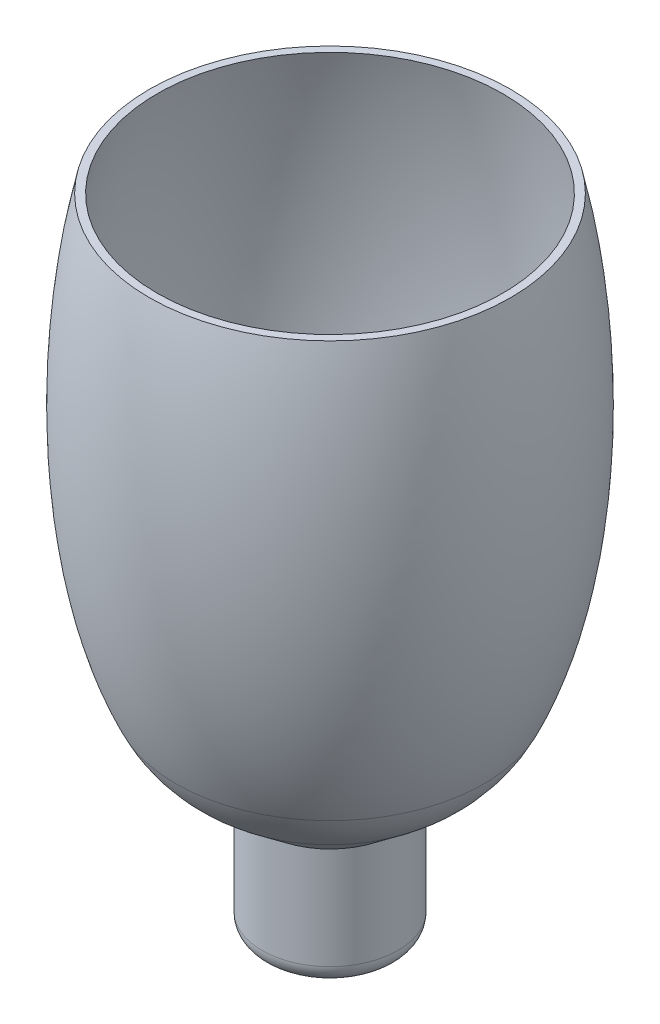
ISO-10303-21;
HEADER;
FILE_DESCRIPTION(('STEP AP214'),'2;1');
FILE_NAME('part.step','',(''),(''),'','','');
FILE_SCHEMA(('AUTOMOTIVE_DESIGN { 1 0 10303 214 1 1 1 1 }'));
ENDSEC;
DATA;
#1=APPLICATION_CONTEXT('core data for automotive mechanical design processes');
#2=APPLICATION_PROTOCOL_DEFINITION('international standard','automotive_design',2000,#1);
#3=PRODUCT_CONTEXT('',#1,'mechanical');
#4=PRODUCT('Part','Part','',(#3));
#5=PRODUCT_RELATED_PRODUCT_CATEGORY('part','',(#4));
#6=PRODUCT_DEFINITION_FORMATION('','',#4);
#7=PRODUCT_DEFINITION_CONTEXT('part definition',#1,'design');
#8=PRODUCT_DEFINITION('design','',#6,#7);
#9=PRODUCT_DEFINITION_SHAPE('','',#8);
#10=(LENGTH_UNIT() NAMED_UNIT(*) SI_UNIT(.MILLI.,.METRE.));
#11=(NAMED_UNIT(*) PLANE_ANGLE_UNIT() SI_UNIT($,.RADIAN.));
#12=(NAMED_UNIT(*) SI_UNIT($,.STERADIAN.) SOLID_ANGLE_UNIT());
#13=UNCERTAINTY_MEASURE_WITH_UNIT(LENGTH_MEASURE(1.E-05),#10,'distance_accuracy_value','');
#14=(GEOMETRIC_REPRESENTATION_CONTEXT(3) GLOBAL_UNCERTAINTY_ASSIGNED_CONTEXT((#13)) GLOBAL_UNIT_ASSIGNED_CONTEXT((#10,
#11,#12)) REPRESENTATION_CONTEXT('',''));
#15=CARTESIAN_POINT('',(0.,0.,0.));
#16=DIRECTION('',(0.,0.,1.));
#17=DIRECTION('',(1.,0.,0.));
#18=AXIS2_PLACEMENT_3D('',#15,#16,#17);
#19=CARTESIAN_POINT('',(-13.,0.,0.));
#20=DIRECTION('',(0.,1.,0.));
#21=DIRECTION('',(0.,0.,1.));
#22=AXIS2_PLACEMENT_3D('',#19,#20,#21);
#23=PLANE('',#22);
#24=CARTESIAN_POINT('',(0.,0.,0.));
#25=DIRECTION('',(0.,-1.,0.));
#26=DIRECTION('',(0.,0.,-1.));
#27=AXIS2_PLACEMENT_3D('',#24,#25,#26);
#28=CIRCLE('',#27,13.);
#29=CARTESIAN_POINT('',(0.,0.,-13.));
#30=VERTEX_POINT('',#29);
#31=EDGE_CURVE('E10',#30,#30,#28,.T.);
#32=ORIENTED_EDGE('',*,*,#31,.T.);
#33=EDGE_LOOP('',(#32));
#34=FACE_BOUND('',#33,.T.);
#35=ADVANCED_FACE('F31',(#34),#23,.F.);
#36=CARTESIAN_POINT('',(0.,5.,0.));
#37=DIRECTION('',(0.,-1.,0.));
#38=DIRECTION('',(0.,0.,-1.));
#39=AXIS2_PLACEMENT_3D('',#36,#37,#38);
#40=TOROIDAL_SURFACE('',#39,13.,5.);
#41=ORIENTED_EDGE('',*,*,#31,.F.);
#42=EDGE_LOOP('',(#41));
#43=FACE_BOUND('',#42,.T.);
#44=CARTESIAN_POINT('',(0.,5.00000000000003,0.));
#45=DIRECTION('',(0.,-1.,0.));
#46=DIRECTION('',(0.,0.,-1.));
#47=AXIS2_PLACEMENT_3D('',#44,#45,#46);
#48=CIRCLE('',#47,18.);
#49=CARTESIAN_POINT('',(0.,5.00000000000003,-18.));
#50=VERTEX_POINT('',#49);
#51=EDGE_CURVE('E37',#50,#50,#48,.T.);
#52=ORIENTED_EDGE('',*,*,#51,.T.);
#53=EDGE_LOOP('',(#52));
#54=FACE_BOUND('',#53,.T.);
#55=ADVANCED_FACE('F90',(#43,#54),#40,.T.);
#56=CARTESIAN_POINT('',(0.,0.,0.));
#57=DIRECTION('',(0.,-1.,0.));
#58=DIRECTION('',(0.,0.,-1.));
#59=AXIS2_PLACEMENT_3D('',#56,#57,#58);
#60=CYLINDRICAL_SURFACE('',#59,18.);
#61=ORIENTED_EDGE('',*,*,#51,.F.);
#62=EDGE_LOOP('',(#61));
#63=FACE_BOUND('',#62,.T.);
#64=CARTESIAN_POINT('',(0.,32.,0.));
#65=DIRECTION('',(0.,-1.,0.));
#66=DIRECTION('',(0.,0.,-1.));
#67=AXIS2_PLACEMENT_3D('',#64,#65,#66);
#68=CIRCLE('',#67,18.);
#69=CARTESIAN_POINT('',(0.,32.,-18.));
#70=VERTEX_POINT('',#69);
#71=EDGE_CURVE('E41',#70,#70,#68,.T.);
#72=ORIENTED_EDGE('',*,*,#71,.T.);
#73=EDGE_LOOP('',(#72));
#74=FACE_BOUND('',#73,.T.);
#75=ADVANCED_FACE('F87',(#63,#74),#60,.T.);
#76=CARTESIAN_POINT('',(0.,41.9691724404206,0.));
#77=DIRECTION('',(0.,1.,0.));
#78=DIRECTION('',(0.,0.,1.));
#79=AXIS2_PLACEMENT_3D('',#76,#77,#78);
#80=CONICAL_SURFACE('',#79,30.7203979744217,0.906064162360728);
#81=ORIENTED_EDGE('',*,*,#71,.F.);
#82=EDGE_LOOP('',(#81));
#83=FACE_BOUND('',#82,.T.);
#84=CARTESIAN_POINT('',(0.,41.9691724404206,0.));
#85=DIRECTION('',(0.,-1.,0.));
#86=DIRECTION('',(0.,0.,-1.));
#87=AXIS2_PLACEMENT_3D('',#84,#85,#86);
#88=CIRCLE('',#87,30.7203979744217);
#89=CARTESIAN_POINT('',(0.,41.9691724404206,-30.7203979744217));
#90=VERTEX_POINT('',#89);
#91=EDGE_CURVE('E45',#90,#90,#88,.T.);
#92=ORIENTED_EDGE('',*,*,#91,.T.);
#93=EDGE_LOOP('',(#92));
#94=FACE_BOUND('',#93,.T.);
#95=ADVANCED_FACE('F83',(#83,#94),#80,.T.);
#96=CARTESIAN_POINT('',(0.,69.5170433953372,0.));
#97=DIRECTION('',(0.,-1.,0.));
#98=DIRECTION('',(0.,0.,-1.));
#99=AXIS2_PLACEMENT_3D('',#96,#97,#98);
#100=DEGENERATE_TOROIDAL_SURFACE('',#99,9.1307058540772,35.,.T.);
#101=ORIENTED_EDGE('',*,*,#91,.F.);
#102=EDGE_LOOP('',(#101));
#103=FACE_BOUND('',#102,.T.);
#104=CARTESIAN_POINT('',(0.,54.635914820331,0.));
#105=DIRECTION('',(0.,-1.,0.));
#106=DIRECTION('',(0.,0.,-1.));
#107=AXIS2_PLACEMENT_3D('',#104,#105,#106);
#108=CIRCLE('',#107,40.8095949181548);
#109=CARTESIAN_POINT('',(0.,54.635914820331,-40.8095949181548));
#110=VERTEX_POINT('',#109);
#111=EDGE_CURVE('E50',#110,#110,#108,.T.);
#112=ORIENTED_EDGE('',*,*,#111,.T.);
#113=EDGE_LOOP('',(#112));
#114=FACE_BOUND('',#113,.T.);
#115=ADVANCED_FACE('F73',(#103,#114),#100,.T.);
#116=CARTESIAN_POINT('',(-47.6005029280847,170.765551901472,0.));
#117=CARTESIAN_POINT('',(-47.6823154498915,170.41097944529,0.));
#118=CARTESIAN_POINT('',(-47.7641279716982,170.056406989108,0.));
#119=CARTESIAN_POINT('',(-47.8459404935049,169.701834532926,0.));
#120=CARTESIAN_POINT('',(-56.0271926741776,134.244588914736,0.));
#121=CARTESIAN_POINT('',(-55.3369313036721,85.5616524371871,0.));
#122=CARTESIAN_POINT('',(-40.8095949181548,54.635914820331,0.));
#123=B_SPLINE_CURVE_WITH_KNOTS('',3,(#116,#117,#118,#119,#120,#121,#122),.UNSPECIFIED.,.F.,.F.,
(4,3,4),(-0.00888014655076905,0.,0.888014655076905),.UNSPECIFIED.);
#124=CARTESIAN_POINT('',(0.,32.,0.));
#125=DIRECTION('',(0.,-1.,0.));
#126=AXIS1_PLACEMENT('',#124,#125);
#127=SURFACE_OF_REVOLUTION('',#123,#126);
#128=ORIENTED_EDGE('',*,*,#111,.F.);
#129=EDGE_LOOP('',(#128));
#130=FACE_BOUND('',#129,.T.);
#131=CARTESIAN_POINT('',(0.,169.701834532926,0.));
#132=DIRECTION('',(0.,-1.,0.));
#133=DIRECTION('',(0.,0.,-1.));
#134=AXIS2_PLACEMENT_3D('',#131,#132,#133);
#135=CIRCLE('',#134,47.8459404935049);
#136=CARTESIAN_POINT('',(0.,169.701834532926,-47.8459404935049));
#137=VERTEX_POINT('',#136);
#138=EDGE_CURVE('E53',#137,#137,#135,.T.);
#139=ORIENTED_EDGE('',*,*,#138,.T.);
#140=EDGE_LOOP('',(#139));
#141=FACE_BOUND('',#140,.T.);
#142=ADVANCED_FACE('F67',(#130,#141),#127,.T.);
#143=CARTESIAN_POINT('',(0.,169.701834532926,0.));
#144=DIRECTION('',(0.,-1.,0.));
#145=DIRECTION('',(0.,0.,-1.));
#146=AXIS2_PLACEMENT_3D('',#143,#144,#145);
#147=PLANE('',#146);
#148=CARTESIAN_POINT('',(0.,169.701834532926,0.));
#149=DIRECTION('',(0.,-1.,0.));
#150=DIRECTION('',(0.,0.,-1.));
#151=AXIS2_PLACEMENT_3D('',#148,#149,#150);
#152=CIRCLE('',#151,45.7933918723425);
#153=CARTESIAN_POINT('',(0.,169.701834532926,-45.7933918723425));
#154=VERTEX_POINT('',#153);
#155=EDGE_CURVE('E61',#154,#154,#152,.T.);
#156=ORIENTED_EDGE('',*,*,#155,.T.);
#157=EDGE_LOOP('',(#156));
#158=FACE_BOUND('',#157,.T.);
#159=ORIENTED_EDGE('',*,*,#138,.F.);
#160=EDGE_LOOP('',(#159));
#161=FACE_BOUND('',#160,.T.);
#162=ADVANCED_FACE('F72',(#158,#161),#147,.F.);
#163=CARTESIAN_POINT('',(-13.,2.,0.));
#164=DIRECTION('',(0.,1.,0.));
#165=DIRECTION('',(0.,0.,1.));
#166=AXIS2_PLACEMENT_3D('',#163,#164,#165);
#167=PLANE('',#166);
#168=CARTESIAN_POINT('',(0.,2.,0.));
#169=DIRECTION('',(0.,-1.,0.));
#170=DIRECTION('',(0.,0.,-1.));
#171=AXIS2_PLACEMENT_3D('',#168,#169,#170);
#172=CIRCLE('',#171,13.);
#173=CARTESIAN_POINT('',(0.,2.,-13.));
#174=VERTEX_POINT('',#173);
#175=EDGE_CURVE('E56',#174,#174,#172,.T.);
#176=ORIENTED_EDGE('',*,*,#175,.F.);
#177=EDGE_LOOP('',(#176));
#178=FACE_BOUND('',#177,.T.);
#179=ADVANCED_FACE('F79',(#178),#167,.T.);
#180=CARTESIAN_POINT('',(0.,5.,0.));
#181=DIRECTION('',(0.,-1.,0.));
#182=DIRECTION('',(0.,0.,-1.));
#183=AXIS2_PLACEMENT_3D('',#180,#181,#182);
#184=TOROIDAL_SURFACE('',#183,13.,3.);
#185=ORIENTED_EDGE('',*,*,#175,.T.);
#186=EDGE_LOOP('',(#185));
#187=FACE_BOUND('',#186,.T.);
#188=CARTESIAN_POINT('',(0.,5.00000000000002,0.));
#189=DIRECTION('',(0.,-1.,0.));
#190=DIRECTION('',(0.,0.,-1.));
#191=AXIS2_PLACEMENT_3D('',#188,#189,#190);
#192=CIRCLE('',#191,16.);
#193=CARTESIAN_POINT('',(0.,5.00000000000002,-16.));
#194=VERTEX_POINT('',#193);
#195=EDGE_CURVE('E206',#194,#194,#192,.T.);
#196=ORIENTED_EDGE('',*,*,#195,.F.);
#197=EDGE_LOOP('',(#196));
#198=FACE_BOUND('',#197,.T.);
#199=ADVANCED_FACE('F142',(#187,#198),#184,.F.);
#200=CARTESIAN_POINT('',(0.,0.,0.));
#201=DIRECTION('',(0.,-1.,0.));
#202=DIRECTION('',(0.,0.,-1.));
#203=AXIS2_PLACEMENT_3D('',#200,#201,#202);
#204=CYLINDRICAL_SURFACE('',#203,16.);
#205=ORIENTED_EDGE('',*,*,#195,.T.);
#206=EDGE_LOOP('',(#205));
#207=FACE_BOUND('',#206,.T.);
#208=CARTESIAN_POINT('',(0.,32.9736003120969,0.));
#209=DIRECTION('',(0.,1.,0.));
#210=DIRECTION('',(0.,0.,1.));
#211=AXIS2_PLACEMENT_3D('',#208,#209,#210);
#212=CIRCLE('',#211,16.);
#213=CARTESIAN_POINT('',(0.,32.9736003120969,16.));
#214=VERTEX_POINT('',#213);
#215=EDGE_CURVE('E201',#214,#214,#212,.F.);
#216=ORIENTED_EDGE('',*,*,#215,.F.);
#217=EDGE_LOOP('',(#216));
#218=FACE_BOUND('',#217,.T.);
#219=ADVANCED_FACE('F152',(#207,#218),#204,.F.);
#220=CARTESIAN_POINT('',(0.,43.5433364949873,0.));
#221=DIRECTION('',(0.,1.,0.));
#222=DIRECTION('',(0.,0.,1.));
#223=AXIS2_PLACEMENT_3D('',#220,#221,#222);
#224=CONICAL_SURFACE('',#223,29.4867012818306,0.906064162360728);
#225=ORIENTED_EDGE('',*,*,#215,.T.);
#226=EDGE_LOOP('',(#225));
#227=FACE_BOUND('',#226,.T.);
#228=CARTESIAN_POINT('',(0.,43.5433364949873,0.));
#229=DIRECTION('',(0.,1.,0.));
#230=DIRECTION('',(0.,0.,1.));
#231=AXIS2_PLACEMENT_3D('',#228,#229,#230);
#232=CIRCLE('',#231,29.4867012818306);
#233=CARTESIAN_POINT('',(0.,43.5433364949873,29.4867012818306));
#234=VERTEX_POINT('',#233);
#235=EDGE_CURVE('E199',#234,#234,#232,.F.);
#236=ORIENTED_EDGE('',*,*,#235,.F.);
#237=EDGE_LOOP('',(#236));
#238=FACE_BOUND('',#237,.T.);
#239=ADVANCED_FACE('F162',(#227,#238),#224,.F.);
#240=CARTESIAN_POINT('',(0.,69.5170433953372,0.));
#241=DIRECTION('',(0.,-1.,0.));
#242=DIRECTION('',(0.,0.,-1.));
#243=AXIS2_PLACEMENT_3D('',#240,#241,#242);
#244=DEGENERATE_TOROIDAL_SURFACE('',#243,9.1307058540772,33.,.T.);
#245=ORIENTED_EDGE('',*,*,#235,.T.);
#246=EDGE_LOOP('',(#245));
#247=FACE_BOUND('',#246,.T.);
#248=CARTESIAN_POINT('',(0.,55.4862650246171,0.));
#249=DIRECTION('',(0.,-1.,0.));
#250=DIRECTION('',(0.,0.,-1.));
#251=AXIS2_PLACEMENT_3D('',#248,#249,#250);
#252=CIRCLE('',#251,38.9993726859218);
#253=CARTESIAN_POINT('',(0.,55.4862650246171,-38.9993726859218));
#254=VERTEX_POINT('',#253);
#255=EDGE_CURVE('E196',#254,#254,#252,.T.);
#256=ORIENTED_EDGE('',*,*,#255,.F.);
#257=EDGE_LOOP('',(#256));
#258=FACE_BOUND('',#257,.T.);
#259=ADVANCED_FACE('F172',(#247,#258),#244,.F.);
#260=CARTESIAN_POINT('',(-47.6005029280847,170.765551901472,0.));
#261=CARTESIAN_POINT('',(-47.6823154498915,170.41097944529,0.));
#262=CARTESIAN_POINT('',(-47.7641279716982,170.056406989108,0.));
#263=CARTESIAN_POINT('',(-56.0271926741776,134.244588914736,0.));
#264=CARTESIAN_POINT('',(-55.3369313036721,85.5616524371871,0.));
#265=CARTESIAN_POINT('',(-40.8095949181548,54.635914820331,0.));
#266=B_SPLINE_CURVE_WITH_KNOTS('',3,(#260,#261,#262,#263,#264,#265),.UNSPECIFIED.,.F.,.F.,(4,2,
4),(-0.00888014655076905,0.,0.888014655076905),.UNSPECIFIED.);
#267=CARTESIAN_POINT('',(0.,32.,0.));
#268=DIRECTION('',(0.,-1.,0.));
#269=AXIS1_PLACEMENT('',#267,#268);
#270=SURFACE_OF_REVOLUTION('',#266,#269);
#271=OFFSET_SURFACE('',#270,-2.,.F.);
#272=ORIENTED_EDGE('',*,*,#255,.T.);
#273=EDGE_LOOP('',(#272));
#274=FACE_BOUND('',#273,.T.);
#275=ORIENTED_EDGE('',*,*,#155,.F.);
#276=EDGE_LOOP('',(#275));
#277=FACE_BOUND('',#276,.T.);
#278=ADVANCED_FACE('F75',(#274,#277),#271,.F.);
#279=CLOSED_SHELL('',(#35,#55,#75,#95,#115,#142,#162,#179,#199,#219,#239,#259,#278));
#280=MANIFOLD_SOLID_BREP('B2',#279);
#281=ADVANCED_BREP_SHAPE_REPRESENTATION('',(#18,#280),#14);
#282=SHAPE_DEFINITION_REPRESENTATION(#9,#281);
ENDSEC;
END-ISO-10303-21;
